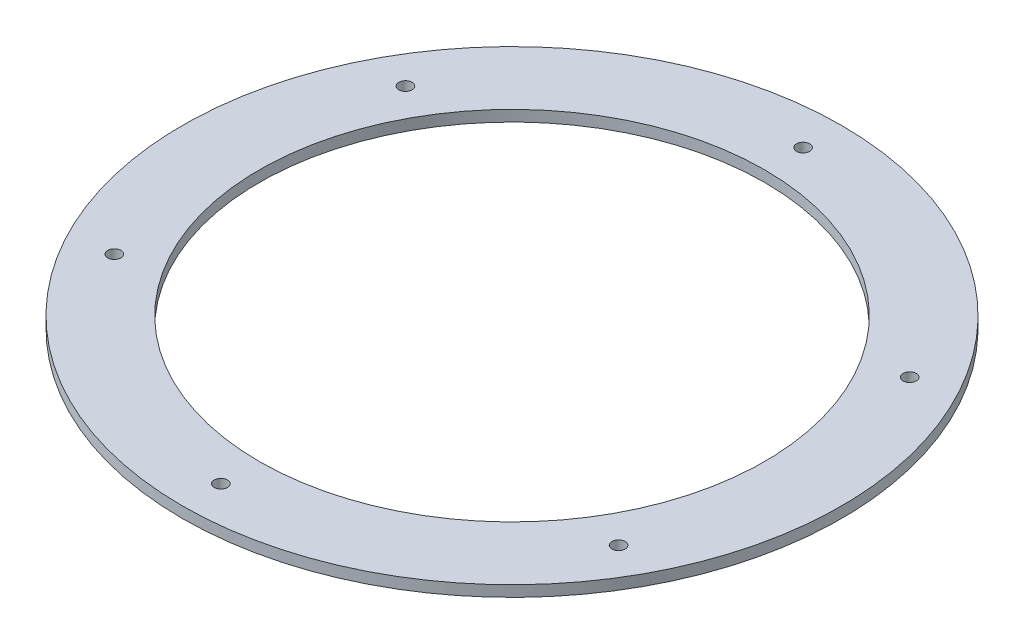
ISO-10303-21;
HEADER;
FILE_DESCRIPTION(('STEP AP214'),'2;1');
FILE_NAME('part.step','',(''),(''),'','','');
FILE_SCHEMA(('AUTOMOTIVE_DESIGN { 1 0 10303 214 1 1 1 1 }'));
ENDSEC;
DATA;
#1=APPLICATION_CONTEXT('core data for automotive mechanical design processes');
#2=APPLICATION_PROTOCOL_DEFINITION('international standard','automotive_design',2000,#1);
#3=PRODUCT_CONTEXT('',#1,'mechanical');
#4=PRODUCT('Part','Part','',(#3));
#5=PRODUCT_RELATED_PRODUCT_CATEGORY('part','',(#4));
#6=PRODUCT_DEFINITION_FORMATION('','',#4);
#7=PRODUCT_DEFINITION_CONTEXT('part definition',#1,'design');
#8=PRODUCT_DEFINITION('design','',#6,#7);
#9=PRODUCT_DEFINITION_SHAPE('','',#8);
#10=(LENGTH_UNIT() NAMED_UNIT(*) SI_UNIT(.MILLI.,.METRE.));
#11=(NAMED_UNIT(*) PLANE_ANGLE_UNIT() SI_UNIT($,.RADIAN.));
#12=(NAMED_UNIT(*) SI_UNIT($,.STERADIAN.) SOLID_ANGLE_UNIT());
#13=UNCERTAINTY_MEASURE_WITH_UNIT(LENGTH_MEASURE(1.E-05),#10,'distance_accuracy_value','');
#14=(GEOMETRIC_REPRESENTATION_CONTEXT(3) GLOBAL_UNCERTAINTY_ASSIGNED_CONTEXT((#13)) GLOBAL_UNIT_ASSIGNED_CONTEXT((#10,
#11,#12)) REPRESENTATION_CONTEXT('',''));
#15=CARTESIAN_POINT('',(0.,0.,0.));
#16=DIRECTION('',(0.,0.,1.));
#17=DIRECTION('',(1.,0.,0.));
#18=AXIS2_PLACEMENT_3D('',#15,#16,#17);
#19=CARTESIAN_POINT('',(0.,5.,0.));
#20=DIRECTION('',(0.,1.,0.));
#21=DIRECTION('',(0.,0.,1.));
#22=AXIS2_PLACEMENT_3D('',#19,#20,#21);
#23=PLANE('',#22);
#24=CARTESIAN_POINT('',(-114.748366001438,5.,66.2500000000001));
#25=DIRECTION('',(0.,1.,0.));
#26=DIRECTION('',(0.,0.,1.));
#27=AXIS2_PLACEMENT_3D('',#24,#25,#26);
#28=CIRCLE('',#27,3.00000000000001);
#29=CARTESIAN_POINT('',(-114.748366001438,5.,69.2500000000001));
#30=VERTEX_POINT('',#29);
#31=EDGE_CURVE('E93',#30,#30,#28,.T.);
#32=ORIENTED_EDGE('',*,*,#31,.F.);
#33=EDGE_LOOP('',(#32));
#34=FACE_BOUND('',#33,.T.);
#35=CARTESIAN_POINT('',(114.748366001438,5.,66.25));
#36=DIRECTION('',(0.,1.,0.));
#37=DIRECTION('',(0.,0.,1.));
#38=AXIS2_PLACEMENT_3D('',#35,#36,#37);
#39=CIRCLE('',#38,3.00000000000054);
#40=CARTESIAN_POINT('',(114.748366001438,5.,69.2500000000005));
#41=VERTEX_POINT('',#40);
#42=EDGE_CURVE('E77',#41,#41,#39,.T.);
#43=ORIENTED_EDGE('',*,*,#42,.F.);
#44=EDGE_LOOP('',(#43));
#45=FACE_BOUND('',#44,.T.);
#46=CARTESIAN_POINT('',(0.,5.,-132.5));
#47=DIRECTION('',(0.,1.,0.));
#48=DIRECTION('',(0.,0.,1.));
#49=AXIS2_PLACEMENT_3D('',#46,#47,#48);
#50=CIRCLE('',#49,3.);
#51=CARTESIAN_POINT('',(0.,5.,-129.5));
#52=VERTEX_POINT('',#51);
#53=EDGE_CURVE('E61',#52,#52,#50,.T.);
#54=ORIENTED_EDGE('',*,*,#53,.F.);
#55=EDGE_LOOP('',(#54));
#56=FACE_BOUND('',#55,.T.);
#57=CARTESIAN_POINT('',(0.,5.,0.));
#58=DIRECTION('',(0.,1.,0.));
#59=DIRECTION('',(0.,0.,1.));
#60=AXIS2_PLACEMENT_3D('',#57,#58,#59);
#61=CIRCLE('',#60,150.);
#62=CARTESIAN_POINT('',(0.,5.,150.));
#63=VERTEX_POINT('',#62);
#64=EDGE_CURVE('E10',#63,#63,#61,.T.);
#65=ORIENTED_EDGE('',*,*,#64,.T.);
#66=EDGE_LOOP('',(#65));
#67=FACE_BOUND('',#66,.T.);
#68=CARTESIAN_POINT('',(0.,5.,0.));
#69=DIRECTION('',(0.,1.,0.));
#70=DIRECTION('',(0.,0.,1.));
#71=AXIS2_PLACEMENT_3D('',#68,#69,#70);
#72=CIRCLE('',#71,115.);
#73=CARTESIAN_POINT('',(0.,5.,115.));
#74=VERTEX_POINT('',#73);
#75=EDGE_CURVE('E55',#74,#74,#72,.T.);
#76=ORIENTED_EDGE('',*,*,#75,.F.);
#77=EDGE_LOOP('',(#76));
#78=FACE_BOUND('',#77,.T.);
#79=CARTESIAN_POINT('',(114.748366001438,5.,-66.25));
#80=DIRECTION('',(0.,1.,0.));
#81=DIRECTION('',(0.,0.,1.));
#82=AXIS2_PLACEMENT_3D('',#79,#80,#81);
#83=CIRCLE('',#82,3.0000000000003);
#84=CARTESIAN_POINT('',(114.748366001438,5.,-63.2499999999997));
#85=VERTEX_POINT('',#84);
#86=EDGE_CURVE('E69',#85,#85,#83,.T.);
#87=ORIENTED_EDGE('',*,*,#86,.F.);
#88=EDGE_LOOP('',(#87));
#89=FACE_BOUND('',#88,.T.);
#90=CARTESIAN_POINT('',(0.,5.,132.5));
#91=DIRECTION('',(0.,1.,0.));
#92=DIRECTION('',(0.,0.,1.));
#93=AXIS2_PLACEMENT_3D('',#90,#91,#92);
#94=CIRCLE('',#93,3.);
#95=CARTESIAN_POINT('',(0.,5.,135.5));
#96=VERTEX_POINT('',#95);
#97=EDGE_CURVE('E85',#96,#96,#94,.T.);
#98=ORIENTED_EDGE('',*,*,#97,.F.);
#99=EDGE_LOOP('',(#98));
#100=FACE_BOUND('',#99,.T.);
#101=CARTESIAN_POINT('',(-114.748366001438,5.,-66.2499999999999));
#102=DIRECTION('',(0.,1.,0.));
#103=DIRECTION('',(0.,0.,1.));
#104=AXIS2_PLACEMENT_3D('',#101,#102,#103);
#105=CIRCLE('',#104,3.00000000000001);
#106=CARTESIAN_POINT('',(-114.748366001438,5.,-63.2499999999999));
#107=VERTEX_POINT('',#106);
#108=EDGE_CURVE('E101',#107,#107,#105,.T.);
#109=ORIENTED_EDGE('',*,*,#108,.F.);
#110=EDGE_LOOP('',(#109));
#111=FACE_BOUND('',#110,.T.);
#112=ADVANCED_FACE('F42',(#34,#45,#56,#67,#78,#89,#100,#111),#23,.T.);
#113=CARTESIAN_POINT('',(0.,0.,0.));
#114=DIRECTION('',(0.,1.,0.));
#115=DIRECTION('',(0.,0.,1.));
#116=AXIS2_PLACEMENT_3D('',#113,#114,#115);
#117=PLANE('',#116);
#118=CARTESIAN_POINT('',(0.,0.,0.));
#119=DIRECTION('',(0.,1.,0.));
#120=DIRECTION('',(0.,0.,1.));
#121=AXIS2_PLACEMENT_3D('',#118,#119,#120);
#122=CIRCLE('',#121,150.);
#123=CARTESIAN_POINT('',(0.,0.,150.));
#124=VERTEX_POINT('',#123);
#125=EDGE_CURVE('E46',#124,#124,#122,.T.);
#126=ORIENTED_EDGE('',*,*,#125,.F.);
#127=EDGE_LOOP('',(#126));
#128=FACE_BOUND('',#127,.T.);
#129=CARTESIAN_POINT('',(0.,0.,0.));
#130=DIRECTION('',(0.,1.,0.));
#131=DIRECTION('',(0.,0.,1.));
#132=AXIS2_PLACEMENT_3D('',#129,#130,#131);
#133=CIRCLE('',#132,115.);
#134=CARTESIAN_POINT('',(0.,0.,115.));
#135=VERTEX_POINT('',#134);
#136=EDGE_CURVE('E57',#135,#135,#133,.T.);
#137=ORIENTED_EDGE('',*,*,#136,.T.);
#138=EDGE_LOOP('',(#137));
#139=FACE_BOUND('',#138,.T.);
#140=CARTESIAN_POINT('',(0.,0.,-132.5));
#141=DIRECTION('',(0.,1.,0.));
#142=DIRECTION('',(0.,0.,1.));
#143=AXIS2_PLACEMENT_3D('',#140,#141,#142);
#144=CIRCLE('',#143,3.);
#145=CARTESIAN_POINT('',(0.,0.,-129.5));
#146=VERTEX_POINT('',#145);
#147=EDGE_CURVE('E65',#146,#146,#144,.T.);
#148=ORIENTED_EDGE('',*,*,#147,.T.);
#149=EDGE_LOOP('',(#148));
#150=FACE_BOUND('',#149,.T.);
#151=CARTESIAN_POINT('',(114.748366001438,0.,-66.25));
#152=DIRECTION('',(0.,1.,0.));
#153=DIRECTION('',(0.,0.,1.));
#154=AXIS2_PLACEMENT_3D('',#151,#152,#153);
#155=CIRCLE('',#154,3.0000000000003);
#156=CARTESIAN_POINT('',(114.748366001438,0.,-63.2499999999997));
#157=VERTEX_POINT('',#156);
#158=EDGE_CURVE('E73',#157,#157,#155,.T.);
#159=ORIENTED_EDGE('',*,*,#158,.T.);
#160=EDGE_LOOP('',(#159));
#161=FACE_BOUND('',#160,.T.);
#162=CARTESIAN_POINT('',(114.748366001438,0.,66.25));
#163=DIRECTION('',(0.,1.,0.));
#164=DIRECTION('',(0.,0.,1.));
#165=AXIS2_PLACEMENT_3D('',#162,#163,#164);
#166=CIRCLE('',#165,3.00000000000054);
#167=CARTESIAN_POINT('',(114.748366001438,0.,69.2500000000005));
#168=VERTEX_POINT('',#167);
#169=EDGE_CURVE('E81',#168,#168,#166,.T.);
#170=ORIENTED_EDGE('',*,*,#169,.T.);
#171=EDGE_LOOP('',(#170));
#172=FACE_BOUND('',#171,.T.);
#173=CARTESIAN_POINT('',(0.,0.,132.5));
#174=DIRECTION('',(0.,1.,0.));
#175=DIRECTION('',(0.,0.,1.));
#176=AXIS2_PLACEMENT_3D('',#173,#174,#175);
#177=CIRCLE('',#176,3.);
#178=CARTESIAN_POINT('',(0.,0.,135.5));
#179=VERTEX_POINT('',#178);
#180=EDGE_CURVE('E89',#179,#179,#177,.T.);
#181=ORIENTED_EDGE('',*,*,#180,.T.);
#182=EDGE_LOOP('',(#181));
#183=FACE_BOUND('',#182,.T.);
#184=CARTESIAN_POINT('',(-114.748366001438,0.,66.2500000000001));
#185=DIRECTION('',(0.,1.,0.));
#186=DIRECTION('',(0.,0.,1.));
#187=AXIS2_PLACEMENT_3D('',#184,#185,#186);
#188=CIRCLE('',#187,3.00000000000001);
#189=CARTESIAN_POINT('',(-114.748366001438,0.,69.2500000000001));
#190=VERTEX_POINT('',#189);
#191=EDGE_CURVE('E97',#190,#190,#188,.T.);
#192=ORIENTED_EDGE('',*,*,#191,.T.);
#193=EDGE_LOOP('',(#192));
#194=FACE_BOUND('',#193,.T.);
#195=CARTESIAN_POINT('',(-114.748366001438,0.,-66.2499999999999));
#196=DIRECTION('',(0.,1.,0.));
#197=DIRECTION('',(0.,0.,1.));
#198=AXIS2_PLACEMENT_3D('',#195,#196,#197);
#199=CIRCLE('',#198,3.00000000000001);
#200=CARTESIAN_POINT('',(-114.748366001438,0.,-63.2499999999999));
#201=VERTEX_POINT('',#200);
#202=EDGE_CURVE('E105',#201,#201,#199,.T.);
#203=ORIENTED_EDGE('',*,*,#202,.T.);
#204=EDGE_LOOP('',(#203));
#205=FACE_BOUND('',#204,.T.);
#206=ADVANCED_FACE('F117',(#128,#139,#150,#161,#172,#183,#194,#205),#117,.F.);
#207=CARTESIAN_POINT('',(0.,5.,0.));
#208=DIRECTION('',(0.,-1.,0.));
#209=DIRECTION('',(0.,0.,-1.));
#210=AXIS2_PLACEMENT_3D('',#207,#208,#209);
#211=CYLINDRICAL_SURFACE('',#210,150.);
#212=ORIENTED_EDGE('',*,*,#64,.F.);
#213=EDGE_LOOP('',(#212));
#214=FACE_BOUND('',#213,.T.);
#215=ORIENTED_EDGE('',*,*,#125,.T.);
#216=EDGE_LOOP('',(#215));
#217=FACE_BOUND('',#216,.T.);
#218=ADVANCED_FACE('F44',(#214,#217),#211,.T.);
#219=CARTESIAN_POINT('',(0.,5.,0.));
#220=DIRECTION('',(0.,-1.,0.));
#221=DIRECTION('',(0.,0.,-1.));
#222=AXIS2_PLACEMENT_3D('',#219,#220,#221);
#223=CYLINDRICAL_SURFACE('',#222,115.);
#224=ORIENTED_EDGE('',*,*,#75,.T.);
#225=EDGE_LOOP('',(#224));
#226=FACE_BOUND('',#225,.T.);
#227=ORIENTED_EDGE('',*,*,#136,.F.);
#228=EDGE_LOOP('',(#227));
#229=FACE_BOUND('',#228,.T.);
#230=ADVANCED_FACE('F127',(#226,#229),#223,.F.);
#231=CARTESIAN_POINT('',(0.,5.,-132.5));
#232=DIRECTION('',(0.,-1.,0.));
#233=DIRECTION('',(0.,0.,-1.));
#234=AXIS2_PLACEMENT_3D('',#231,#232,#233);
#235=CYLINDRICAL_SURFACE('',#234,3.);
#236=ORIENTED_EDGE('',*,*,#53,.T.);
#237=EDGE_LOOP('',(#236));
#238=FACE_BOUND('',#237,.T.);
#239=ORIENTED_EDGE('',*,*,#147,.F.);
#240=EDGE_LOOP('',(#239));
#241=FACE_BOUND('',#240,.T.);
#242=ADVANCED_FACE('F130',(#238,#241),#235,.F.);
#243=CARTESIAN_POINT('',(114.748366001438,5.,-66.25));
#244=DIRECTION('',(0.,-1.,0.));
#245=DIRECTION('',(0.,0.,-1.));
#246=AXIS2_PLACEMENT_3D('',#243,#244,#245);
#247=CYLINDRICAL_SURFACE('',#246,3.0000000000003);
#248=ORIENTED_EDGE('',*,*,#86,.T.);
#249=EDGE_LOOP('',(#248));
#250=FACE_BOUND('',#249,.T.);
#251=ORIENTED_EDGE('',*,*,#158,.F.);
#252=EDGE_LOOP('',(#251));
#253=FACE_BOUND('',#252,.T.);
#254=ADVANCED_FACE('F134',(#250,#253),#247,.F.);
#255=CARTESIAN_POINT('',(114.748366001438,5.,66.25));
#256=DIRECTION('',(0.,-1.,0.));
#257=DIRECTION('',(0.,0.,-1.));
#258=AXIS2_PLACEMENT_3D('',#255,#256,#257);
#259=CYLINDRICAL_SURFACE('',#258,3.00000000000054);
#260=ORIENTED_EDGE('',*,*,#42,.T.);
#261=EDGE_LOOP('',(#260));
#262=FACE_BOUND('',#261,.T.);
#263=ORIENTED_EDGE('',*,*,#169,.F.);
#264=EDGE_LOOP('',(#263));
#265=FACE_BOUND('',#264,.T.);
#266=ADVANCED_FACE('F138',(#262,#265),#259,.F.);
#267=CARTESIAN_POINT('',(0.,5.,132.5));
#268=DIRECTION('',(0.,-1.,0.));
#269=DIRECTION('',(0.,0.,-1.));
#270=AXIS2_PLACEMENT_3D('',#267,#268,#269);
#271=CYLINDRICAL_SURFACE('',#270,3.);
#272=ORIENTED_EDGE('',*,*,#97,.T.);
#273=EDGE_LOOP('',(#272));
#274=FACE_BOUND('',#273,.T.);
#275=ORIENTED_EDGE('',*,*,#180,.F.);
#276=EDGE_LOOP('',(#275));
#277=FACE_BOUND('',#276,.T.);
#278=ADVANCED_FACE('F142',(#274,#277),#271,.F.);
#279=CARTESIAN_POINT('',(-114.748366001438,5.,66.2500000000001));
#280=DIRECTION('',(0.,-1.,0.));
#281=DIRECTION('',(0.,0.,-1.));
#282=AXIS2_PLACEMENT_3D('',#279,#280,#281);
#283=CYLINDRICAL_SURFACE('',#282,3.00000000000001);
#284=ORIENTED_EDGE('',*,*,#31,.T.);
#285=EDGE_LOOP('',(#284));
#286=FACE_BOUND('',#285,.T.);
#287=ORIENTED_EDGE('',*,*,#191,.F.);
#288=EDGE_LOOP('',(#287));
#289=FACE_BOUND('',#288,.T.);
#290=ADVANCED_FACE('F146',(#286,#289),#283,.F.);
#291=CARTESIAN_POINT('',(-114.748366001438,5.,-66.2499999999999));
#292=DIRECTION('',(0.,-1.,0.));
#293=DIRECTION('',(0.,0.,-1.));
#294=AXIS2_PLACEMENT_3D('',#291,#292,#293);
#295=CYLINDRICAL_SURFACE('',#294,3.00000000000001);
#296=ORIENTED_EDGE('',*,*,#108,.T.);
#297=EDGE_LOOP('',(#296));
#298=FACE_BOUND('',#297,.T.);
#299=ORIENTED_EDGE('',*,*,#202,.F.);
#300=EDGE_LOOP('',(#299));
#301=FACE_BOUND('',#300,.T.);
#302=ADVANCED_FACE('F113',(#298,#301),#295,.F.);
#303=CLOSED_SHELL('',(#112,#206,#218,#230,#242,#254,#266,#278,#290,#302));
#304=MANIFOLD_SOLID_BREP('B2',#303);
#305=ADVANCED_BREP_SHAPE_REPRESENTATION('',(#18,#304),#14);
#306=SHAPE_DEFINITION_REPRESENTATION(#9,#305);
ENDSEC;
END-ISO-10303-21;
